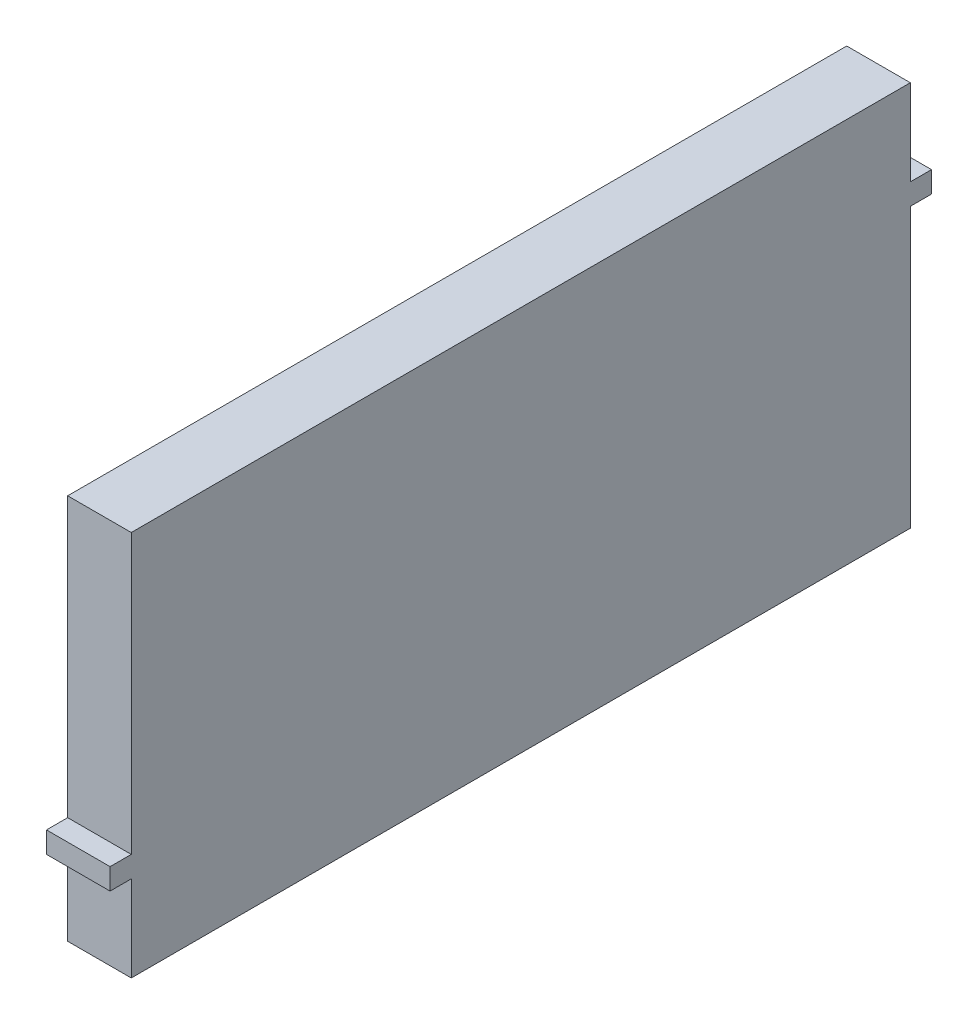
ISO-10303-21;
HEADER;
FILE_DESCRIPTION(('STEP AP214'),'2;1');
FILE_NAME('part.step','',(''),(''),'','','');
FILE_SCHEMA(('AUTOMOTIVE_DESIGN { 1 0 10303 214 1 1 1 1 }'));
ENDSEC;
DATA;
#1=APPLICATION_CONTEXT('core data for automotive mechanical design processes');
#2=APPLICATION_PROTOCOL_DEFINITION('international standard','automotive_design',2000,#1);
#3=PRODUCT_CONTEXT('',#1,'mechanical');
#4=PRODUCT('Part','Part','',(#3));
#5=PRODUCT_RELATED_PRODUCT_CATEGORY('part','',(#4));
#6=PRODUCT_DEFINITION_FORMATION('','',#4);
#7=PRODUCT_DEFINITION_CONTEXT('part definition',#1,'design');
#8=PRODUCT_DEFINITION('design','',#6,#7);
#9=PRODUCT_DEFINITION_SHAPE('','',#8);
#10=(LENGTH_UNIT() NAMED_UNIT(*) SI_UNIT(.MILLI.,.METRE.));
#11=(NAMED_UNIT(*) PLANE_ANGLE_UNIT() SI_UNIT($,.RADIAN.));
#12=(NAMED_UNIT(*) SI_UNIT($,.STERADIAN.) SOLID_ANGLE_UNIT());
#13=UNCERTAINTY_MEASURE_WITH_UNIT(LENGTH_MEASURE(1.E-05),#10,'distance_accuracy_value','');
#14=(GEOMETRIC_REPRESENTATION_CONTEXT(3) GLOBAL_UNCERTAINTY_ASSIGNED_CONTEXT((#13)) GLOBAL_UNIT_ASSIGNED_CONTEXT((#10,
#11,#12)) REPRESENTATION_CONTEXT('',''));
#15=CARTESIAN_POINT('',(0.,0.,0.));
#16=DIRECTION('',(0.,0.,1.));
#17=DIRECTION('',(1.,0.,0.));
#18=AXIS2_PLACEMENT_3D('',#15,#16,#17);
#19=CARTESIAN_POINT('',(388.468402146903,403.484208454733,439.53744407791));
#20=DIRECTION('',(0.,0.,1.));
#21=DIRECTION('',(0.,-1.,0.));
#22=AXIS2_PLACEMENT_3D('',#19,#20,#21);
#23=PLANE('',#22);
#24=DIRECTION('',(0.,1.,0.));
#25=VECTOR('',#24,1.);
#26=CARTESIAN_POINT('',(252.542706630704,403.484208454733,439.53744407791));
#27=LINE('',#26,#25);
#28=CARTESIAN_POINT('',(252.542706630704,403.484208454733,439.53744407791));
#29=VERTEX_POINT('',#28);
#30=CARTESIAN_POINT('',(252.542706630704,406.659208454733,439.53744407791));
#31=VERTEX_POINT('',#30);
#32=EDGE_CURVE('E168',#29,#31,#27,.T.);
#33=ORIENTED_EDGE('',*,*,#32,.F.);
#34=DIRECTION('',(-1.,0.,0.));
#35=VECTOR('',#34,1.);
#36=CARTESIAN_POINT('',(388.468402146903,403.484208454733,439.53744407791));
#37=LINE('',#36,#35);
#38=CARTESIAN_POINT('',(243.017706630704,403.484208454733,439.53744407791));
#39=VERTEX_POINT('',#38);
#40=EDGE_CURVE('E37',#29,#39,#37,.T.);
#41=ORIENTED_EDGE('',*,*,#40,.T.);
#42=DIRECTION('',(0.,1.,0.));
#43=VECTOR('',#42,1.);
#44=CARTESIAN_POINT('',(243.017706630704,403.484208454733,439.53744407791));
#45=LINE('',#44,#43);
#46=CARTESIAN_POINT('',(243.017706630704,406.659208454733,439.53744407791));
#47=VERTEX_POINT('',#46);
#48=EDGE_CURVE('E176',#39,#47,#45,.T.);
#49=ORIENTED_EDGE('',*,*,#48,.T.);
#50=DIRECTION('',(-1.,0.,0.));
#51=VECTOR('',#50,1.);
#52=CARTESIAN_POINT('',(388.468402146903,406.659208454733,439.53744407791));
#53=LINE('',#52,#51);
#54=EDGE_CURVE('E104',#31,#47,#53,.T.);
#55=ORIENTED_EDGE('',*,*,#54,.F.);
#56=EDGE_LOOP('',(#33,#41,#49,#55));
#57=FACE_BOUND('',#56,.T.);
#58=ADVANCED_FACE('F33',(#57),#23,.F.);
#59=CARTESIAN_POINT('',(388.468402146903,406.659208454733,439.53744407791));
#60=DIRECTION('',(0.,-1.,0.));
#61=DIRECTION('',(0.,0.,-1.));
#62=AXIS2_PLACEMENT_3D('',#59,#60,#61);
#63=PLANE('',#62);
#64=DIRECTION('',(0.,0.,1.));
#65=VECTOR('',#64,1.);
#66=CARTESIAN_POINT('',(252.542706630704,406.659208454733,439.53744407791));
#67=LINE('',#66,#65);
#68=CARTESIAN_POINT('',(252.542706630704,406.659208454733,442.71244407791));
#69=VERTEX_POINT('',#68);
#70=EDGE_CURVE('E111',#31,#69,#67,.T.);
#71=ORIENTED_EDGE('',*,*,#70,.F.);
#72=ORIENTED_EDGE('',*,*,#54,.T.);
#73=DIRECTION('',(0.,0.,1.));
#74=VECTOR('',#73,1.);
#75=CARTESIAN_POINT('',(243.017706630704,406.659208454733,439.53744407791));
#76=LINE('',#75,#74);
#77=CARTESIAN_POINT('',(243.017706630704,406.659208454733,442.71244407791));
#78=VERTEX_POINT('',#77);
#79=EDGE_CURVE('E175',#47,#78,#76,.T.);
#80=ORIENTED_EDGE('',*,*,#79,.T.);
#81=DIRECTION('',(-1.,0.,0.));
#82=VECTOR('',#81,1.);
#83=CARTESIAN_POINT('',(388.468402146903,406.659208454733,442.71244407791));
#84=LINE('',#83,#82);
#85=EDGE_CURVE('E177',#69,#78,#84,.T.);
#86=ORIENTED_EDGE('',*,*,#85,.F.);
#87=EDGE_LOOP('',(#71,#72,#80,#86));
#88=FACE_BOUND('',#87,.T.);
#89=ADVANCED_FACE('F226',(#88),#63,.F.);
#90=CARTESIAN_POINT('',(388.468402146903,406.659208454733,442.71244407791));
#91=DIRECTION('',(0.,0.,1.));
#92=DIRECTION('',(0.,-1.,0.));
#93=AXIS2_PLACEMENT_3D('',#90,#91,#92);
#94=PLANE('',#93);
#95=DIRECTION('',(0.,1.,0.));
#96=VECTOR('',#95,1.);
#97=CARTESIAN_POINT('',(252.542706630704,406.659208454733,442.71244407791));
#98=LINE('',#97,#96);
#99=CARTESIAN_POINT('',(252.542706630704,419.517958454733,442.71244407791));
#100=VERTEX_POINT('',#99);
#101=EDGE_CURVE('E164',#69,#100,#98,.T.);
#102=ORIENTED_EDGE('',*,*,#101,.F.);
#103=ORIENTED_EDGE('',*,*,#85,.T.);
#104=DIRECTION('',(0.,1.,0.));
#105=VECTOR('',#104,1.);
#106=CARTESIAN_POINT('',(243.017706630704,406.659208454733,442.71244407791));
#107=LINE('',#106,#105);
#108=CARTESIAN_POINT('',(243.017706630704,419.517958454733,442.71244407791));
#109=VERTEX_POINT('',#108);
#110=EDGE_CURVE('E179',#78,#109,#107,.T.);
#111=ORIENTED_EDGE('',*,*,#110,.T.);
#112=DIRECTION('',(-1.,0.,0.));
#113=VECTOR('',#112,1.);
#114=CARTESIAN_POINT('',(388.468402146903,419.517958454733,442.71244407791));
#115=LINE('',#114,#113);
#116=EDGE_CURVE('E180',#100,#109,#115,.T.);
#117=ORIENTED_EDGE('',*,*,#116,.F.);
#118=EDGE_LOOP('',(#102,#103,#111,#117));
#119=FACE_BOUND('',#118,.T.);
#120=ADVANCED_FACE('F229',(#119),#94,.F.);
#121=CARTESIAN_POINT('',(388.468402146903,419.517958454733,559.39369407791));
#122=DIRECTION('',(0.,-1.,0.));
#123=DIRECTION('',(0.,0.,-1.));
#124=AXIS2_PLACEMENT_3D('',#121,#122,#123);
#125=PLANE('',#124);
#126=DIRECTION('',(0.,0.,1.));
#127=VECTOR('',#126,1.);
#128=CARTESIAN_POINT('',(252.542706630704,419.517958454733,559.39369407791));
#129=LINE('',#128,#127);
#130=CARTESIAN_POINT('',(252.542706630704,419.517958454733,559.39369407791));
#131=VERTEX_POINT('',#130);
#132=EDGE_CURVE('E161',#100,#131,#129,.T.);
#133=ORIENTED_EDGE('',*,*,#132,.F.);
#134=ORIENTED_EDGE('',*,*,#116,.T.);
#135=DIRECTION('',(0.,0.,1.));
#136=VECTOR('',#135,1.);
#137=CARTESIAN_POINT('',(243.017706630704,419.517958454733,559.39369407791));
#138=LINE('',#137,#136);
#139=CARTESIAN_POINT('',(243.017706630704,419.517958454733,559.39369407791));
#140=VERTEX_POINT('',#139);
#141=EDGE_CURVE('E182',#109,#140,#138,.T.);
#142=ORIENTED_EDGE('',*,*,#141,.T.);
#143=DIRECTION('',(-1.,0.,0.));
#144=VECTOR('',#143,1.);
#145=CARTESIAN_POINT('',(388.468402146903,419.517958454733,559.39369407791));
#146=LINE('',#145,#144);
#147=EDGE_CURVE('E183',#131,#140,#146,.T.);
#148=ORIENTED_EDGE('',*,*,#147,.F.);
#149=EDGE_LOOP('',(#133,#134,#142,#148));
#150=FACE_BOUND('',#149,.T.);
#151=ADVANCED_FACE('F231',(#150),#125,.F.);
#152=CARTESIAN_POINT('',(388.468402146903,377.766708454733,559.39369407791));
#153=DIRECTION('',(0.,0.,-1.));
#154=DIRECTION('',(-1.,0.,0.));
#155=AXIS2_PLACEMENT_3D('',#152,#153,#154);
#156=PLANE('',#155);
#157=DIRECTION('',(0.,-1.,0.));
#158=VECTOR('',#157,1.);
#159=CARTESIAN_POINT('',(252.542706630704,377.766708454733,559.39369407791));
#160=LINE('',#159,#158);
#161=CARTESIAN_POINT('',(252.542706630704,377.766708454733,559.39369407791));
#162=VERTEX_POINT('',#161);
#163=EDGE_CURVE('E158',#131,#162,#160,.T.);
#164=ORIENTED_EDGE('',*,*,#163,.F.);
#165=ORIENTED_EDGE('',*,*,#147,.T.);
#166=DIRECTION('',(0.,-1.,0.));
#167=VECTOR('',#166,1.);
#168=CARTESIAN_POINT('',(243.017706630704,377.766708454733,559.39369407791));
#169=LINE('',#168,#167);
#170=CARTESIAN_POINT('',(243.017706630704,377.766708454733,559.39369407791));
#171=VERTEX_POINT('',#170);
#172=EDGE_CURVE('E185',#140,#171,#169,.T.);
#173=ORIENTED_EDGE('',*,*,#172,.T.);
#174=DIRECTION('',(-1.,0.,0.));
#175=VECTOR('',#174,1.);
#176=CARTESIAN_POINT('',(388.468402146903,377.766708454733,559.39369407791));
#177=LINE('',#176,#175);
#178=EDGE_CURVE('E186',#162,#171,#177,.T.);
#179=ORIENTED_EDGE('',*,*,#178,.F.);
#180=EDGE_LOOP('',(#164,#165,#173,#179));
#181=FACE_BOUND('',#180,.T.);
#182=ADVANCED_FACE('F235',(#181),#156,.F.);
#183=CARTESIAN_POINT('',(388.468402146903,377.766708454733,559.39369407791));
#184=DIRECTION('',(0.,-1.,0.));
#185=DIRECTION('',(0.,0.,-1.));
#186=AXIS2_PLACEMENT_3D('',#183,#184,#185);
#187=PLANE('',#186);
#188=DIRECTION('',(0.,0.,1.));
#189=VECTOR('',#188,1.);
#190=CARTESIAN_POINT('',(252.542706630704,377.766708454733,559.39369407791));
#191=LINE('',#190,#189);
#192=CARTESIAN_POINT('',(252.542706630704,377.766708454733,562.56869407791));
#193=VERTEX_POINT('',#192);
#194=EDGE_CURVE('E155',#162,#193,#191,.T.);
#195=ORIENTED_EDGE('',*,*,#194,.F.);
#196=ORIENTED_EDGE('',*,*,#178,.T.);
#197=DIRECTION('',(0.,0.,1.));
#198=VECTOR('',#197,1.);
#199=CARTESIAN_POINT('',(243.017706630704,377.766708454733,559.39369407791));
#200=LINE('',#199,#198);
#201=CARTESIAN_POINT('',(243.017706630704,377.766708454733,562.56869407791));
#202=VERTEX_POINT('',#201);
#203=EDGE_CURVE('E188',#171,#202,#200,.T.);
#204=ORIENTED_EDGE('',*,*,#203,.T.);
#205=DIRECTION('',(-1.,0.,0.));
#206=VECTOR('',#205,1.);
#207=CARTESIAN_POINT('',(388.468402146903,377.766708454733,562.56869407791));
#208=LINE('',#207,#206);
#209=EDGE_CURVE('E189',#193,#202,#208,.T.);
#210=ORIENTED_EDGE('',*,*,#209,.F.);
#211=EDGE_LOOP('',(#195,#196,#204,#210));
#212=FACE_BOUND('',#211,.T.);
#213=ADVANCED_FACE('F240',(#212),#187,.F.);
#214=CARTESIAN_POINT('',(388.468402146903,377.766708454733,562.56869407791));
#215=DIRECTION('',(0.,0.,-1.));
#216=DIRECTION('',(-1.,0.,0.));
#217=AXIS2_PLACEMENT_3D('',#214,#215,#216);
#218=PLANE('',#217);
#219=DIRECTION('',(0.,-1.,0.));
#220=VECTOR('',#219,1.);
#221=CARTESIAN_POINT('',(252.542706630704,377.766708454733,562.56869407791));
#222=LINE('',#221,#220);
#223=CARTESIAN_POINT('',(252.542706630704,374.591708454733,562.56869407791));
#224=VERTEX_POINT('',#223);
#225=EDGE_CURVE('E152',#193,#224,#222,.T.);
#226=ORIENTED_EDGE('',*,*,#225,.F.);
#227=ORIENTED_EDGE('',*,*,#209,.T.);
#228=DIRECTION('',(0.,-1.,0.));
#229=VECTOR('',#228,1.);
#230=CARTESIAN_POINT('',(243.017706630704,377.766708454733,562.56869407791));
#231=LINE('',#230,#229);
#232=CARTESIAN_POINT('',(243.017706630704,374.591708454733,562.56869407791));
#233=VERTEX_POINT('',#232);
#234=EDGE_CURVE('E191',#202,#233,#231,.T.);
#235=ORIENTED_EDGE('',*,*,#234,.T.);
#236=DIRECTION('',(-1.,0.,0.));
#237=VECTOR('',#236,1.);
#238=CARTESIAN_POINT('',(388.468402146903,374.591708454733,562.56869407791));
#239=LINE('',#238,#237);
#240=EDGE_CURVE('E192',#224,#233,#239,.T.);
#241=ORIENTED_EDGE('',*,*,#240,.F.);
#242=EDGE_LOOP('',(#226,#227,#235,#241));
#243=FACE_BOUND('',#242,.T.);
#244=ADVANCED_FACE('F243',(#243),#218,.F.);
#245=CARTESIAN_POINT('',(388.468402146903,374.591708454733,562.56869407791));
#246=DIRECTION('',(0.,1.,0.));
#247=DIRECTION('',(0.,0.,1.));
#248=AXIS2_PLACEMENT_3D('',#245,#246,#247);
#249=PLANE('',#248);
#250=DIRECTION('',(0.,0.,-1.));
#251=VECTOR('',#250,1.);
#252=CARTESIAN_POINT('',(252.542706630704,374.591708454733,562.56869407791));
#253=LINE('',#252,#251);
#254=CARTESIAN_POINT('',(252.542706630704,374.591708454733,559.39369407791));
#255=VERTEX_POINT('',#254);
#256=EDGE_CURVE('E147',#224,#255,#253,.T.);
#257=ORIENTED_EDGE('',*,*,#256,.F.);
#258=ORIENTED_EDGE('',*,*,#240,.T.);
#259=DIRECTION('',(0.,0.,-1.));
#260=VECTOR('',#259,1.);
#261=CARTESIAN_POINT('',(243.017706630704,374.591708454733,562.56869407791));
#262=LINE('',#261,#260);
#263=CARTESIAN_POINT('',(243.017706630704,374.591708454733,559.39369407791));
#264=VERTEX_POINT('',#263);
#265=EDGE_CURVE('E194',#233,#264,#262,.T.);
#266=ORIENTED_EDGE('',*,*,#265,.T.);
#267=DIRECTION('',(-1.,0.,0.));
#268=VECTOR('',#267,1.);
#269=CARTESIAN_POINT('',(388.468402146903,374.591708454733,559.39369407791));
#270=LINE('',#269,#268);
#271=EDGE_CURVE('E195',#255,#264,#270,.T.);
#272=ORIENTED_EDGE('',*,*,#271,.F.);
#273=EDGE_LOOP('',(#257,#258,#266,#272));
#274=FACE_BOUND('',#273,.T.);
#275=ADVANCED_FACE('F247',(#274),#249,.F.);
#276=CARTESIAN_POINT('',(388.468402146903,361.732958454733,559.39369407791));
#277=DIRECTION('',(0.,0.,-1.));
#278=DIRECTION('',(-1.,0.,0.));
#279=AXIS2_PLACEMENT_3D('',#276,#277,#278);
#280=PLANE('',#279);
#281=DIRECTION('',(0.,-1.,0.));
#282=VECTOR('',#281,1.);
#283=CARTESIAN_POINT('',(252.542706630704,361.732958454733,559.39369407791));
#284=LINE('',#283,#282);
#285=CARTESIAN_POINT('',(252.542706630704,361.732958454733,559.39369407791));
#286=VERTEX_POINT('',#285);
#287=EDGE_CURVE('E145',#255,#286,#284,.T.);
#288=ORIENTED_EDGE('',*,*,#287,.F.);
#289=ORIENTED_EDGE('',*,*,#271,.T.);
#290=DIRECTION('',(0.,-1.,0.));
#291=VECTOR('',#290,1.);
#292=CARTESIAN_POINT('',(243.017706630704,361.732958454733,559.39369407791));
#293=LINE('',#292,#291);
#294=CARTESIAN_POINT('',(243.017706630704,361.732958454733,559.39369407791));
#295=VERTEX_POINT('',#294);
#296=EDGE_CURVE('E197',#264,#295,#293,.T.);
#297=ORIENTED_EDGE('',*,*,#296,.T.);
#298=DIRECTION('',(-1.,0.,0.));
#299=VECTOR('',#298,1.);
#300=CARTESIAN_POINT('',(388.468402146903,361.732958454733,559.39369407791));
#301=LINE('',#300,#299);
#302=EDGE_CURVE('E198',#286,#295,#301,.T.);
#303=ORIENTED_EDGE('',*,*,#302,.F.);
#304=EDGE_LOOP('',(#288,#289,#297,#303));
#305=FACE_BOUND('',#304,.T.);
#306=ADVANCED_FACE('F251',(#305),#280,.F.);
#307=CARTESIAN_POINT('',(388.468402146903,361.732958454733,442.71244407791));
#308=DIRECTION('',(0.,1.,0.));
#309=DIRECTION('',(0.,0.,1.));
#310=AXIS2_PLACEMENT_3D('',#307,#308,#309);
#311=PLANE('',#310);
#312=DIRECTION('',(0.,0.,-1.));
#313=VECTOR('',#312,1.);
#314=CARTESIAN_POINT('',(252.542706630704,361.732958454733,442.71244407791));
#315=LINE('',#314,#313);
#316=CARTESIAN_POINT('',(252.542706630704,361.732958454733,442.71244407791));
#317=VERTEX_POINT('',#316);
#318=EDGE_CURVE('E42',#286,#317,#315,.T.);
#319=ORIENTED_EDGE('',*,*,#318,.F.);
#320=ORIENTED_EDGE('',*,*,#302,.T.);
#321=DIRECTION('',(0.,0.,-1.));
#322=VECTOR('',#321,1.);
#323=CARTESIAN_POINT('',(243.017706630704,361.732958454733,442.71244407791));
#324=LINE('',#323,#322);
#325=CARTESIAN_POINT('',(243.017706630704,361.732958454733,442.71244407791));
#326=VERTEX_POINT('',#325);
#327=EDGE_CURVE('E139',#295,#326,#324,.T.);
#328=ORIENTED_EDGE('',*,*,#327,.T.);
#329=DIRECTION('',(-1.,0.,0.));
#330=VECTOR('',#329,1.);
#331=CARTESIAN_POINT('',(388.468402146903,361.732958454733,442.71244407791));
#332=LINE('',#331,#330);
#333=EDGE_CURVE('E130',#317,#326,#332,.T.);
#334=ORIENTED_EDGE('',*,*,#333,.F.);
#335=EDGE_LOOP('',(#319,#320,#328,#334));
#336=FACE_BOUND('',#335,.T.);
#337=ADVANCED_FACE('F136',(#336),#311,.F.);
#338=CARTESIAN_POINT('',(388.468402146903,403.484208454733,442.71244407791));
#339=DIRECTION('',(0.,0.,1.));
#340=DIRECTION('',(1.,0.,0.));
#341=AXIS2_PLACEMENT_3D('',#338,#339,#340);
#342=PLANE('',#341);
#343=DIRECTION('',(0.,1.,0.));
#344=VECTOR('',#343,1.);
#345=CARTESIAN_POINT('',(252.542706630704,403.484208454733,442.71244407791));
#346=LINE('',#345,#344);
#347=CARTESIAN_POINT('',(252.542706630704,403.484208454733,442.71244407791));
#348=VERTEX_POINT('',#347);
#349=EDGE_CURVE('E11',#317,#348,#346,.T.);
#350=ORIENTED_EDGE('',*,*,#349,.F.);
#351=ORIENTED_EDGE('',*,*,#333,.T.);
#352=DIRECTION('',(0.,1.,0.));
#353=VECTOR('',#352,1.);
#354=CARTESIAN_POINT('',(243.017706630704,403.484208454733,442.71244407791));
#355=LINE('',#354,#353);
#356=CARTESIAN_POINT('',(243.017706630704,403.484208454733,442.71244407791));
#357=VERTEX_POINT('',#356);
#358=EDGE_CURVE('E141',#326,#357,#355,.T.);
#359=ORIENTED_EDGE('',*,*,#358,.T.);
#360=DIRECTION('',(-1.,0.,0.));
#361=VECTOR('',#360,1.);
#362=CARTESIAN_POINT('',(388.468402146903,403.484208454733,442.71244407791));
#363=LINE('',#362,#361);
#364=EDGE_CURVE('E55',#348,#357,#363,.T.);
#365=ORIENTED_EDGE('',*,*,#364,.F.);
#366=EDGE_LOOP('',(#350,#351,#359,#365));
#367=FACE_BOUND('',#366,.T.);
#368=ADVANCED_FACE('F129',(#367),#342,.F.);
#369=CARTESIAN_POINT('',(388.468402146903,403.484208454733,442.71244407791));
#370=DIRECTION('',(0.,1.,0.));
#371=DIRECTION('',(0.,0.,1.));
#372=AXIS2_PLACEMENT_3D('',#369,#370,#371);
#373=PLANE('',#372);
#374=DIRECTION('',(0.,0.,-1.));
#375=VECTOR('',#374,1.);
#376=CARTESIAN_POINT('',(252.542706630704,403.484208454733,442.71244407791));
#377=LINE('',#376,#375);
#378=EDGE_CURVE('E171',#348,#29,#377,.T.);
#379=ORIENTED_EDGE('',*,*,#378,.F.);
#380=ORIENTED_EDGE('',*,*,#364,.T.);
#381=DIRECTION('',(0.,0.,-1.));
#382=VECTOR('',#381,1.);
#383=CARTESIAN_POINT('',(243.017706630704,403.484208454733,442.71244407791));
#384=LINE('',#383,#382);
#385=EDGE_CURVE('E173',#357,#39,#384,.T.);
#386=ORIENTED_EDGE('',*,*,#385,.T.);
#387=ORIENTED_EDGE('',*,*,#40,.F.);
#388=EDGE_LOOP('',(#379,#380,#386,#387));
#389=FACE_BOUND('',#388,.T.);
#390=ADVANCED_FACE('F221',(#389),#373,.F.);
#391=CARTESIAN_POINT('',(243.017706630704,0.,0.));
#392=DIRECTION('',(1.,0.,0.));
#393=DIRECTION('',(0.,0.,-1.));
#394=AXIS2_PLACEMENT_3D('',#391,#392,#393);
#395=PLANE('',#394);
#396=ORIENTED_EDGE('',*,*,#48,.F.);
#397=ORIENTED_EDGE('',*,*,#385,.F.);
#398=ORIENTED_EDGE('',*,*,#358,.F.);
#399=ORIENTED_EDGE('',*,*,#327,.F.);
#400=ORIENTED_EDGE('',*,*,#296,.F.);
#401=ORIENTED_EDGE('',*,*,#265,.F.);
#402=ORIENTED_EDGE('',*,*,#234,.F.);
#403=ORIENTED_EDGE('',*,*,#203,.F.);
#404=ORIENTED_EDGE('',*,*,#172,.F.);
#405=ORIENTED_EDGE('',*,*,#141,.F.);
#406=ORIENTED_EDGE('',*,*,#110,.F.);
#407=ORIENTED_EDGE('',*,*,#79,.F.);
#408=EDGE_LOOP('',(#396,#397,#398,#399,#400,#401,#402,#403,#404,#405,#406,#407));
#409=FACE_BOUND('',#408,.T.);
#410=ADVANCED_FACE('F223',(#409),#395,.F.);
#411=CARTESIAN_POINT('',(252.542706630704,403.484208454733,802.28119407791));
#412=DIRECTION('',(1.,0.,0.));
#413=DIRECTION('',(0.,0.,-1.));
#414=AXIS2_PLACEMENT_3D('',#411,#412,#413);
#415=PLANE('',#414);
#416=ORIENTED_EDGE('',*,*,#378,.T.);
#417=ORIENTED_EDGE('',*,*,#32,.T.);
#418=ORIENTED_EDGE('',*,*,#70,.T.);
#419=ORIENTED_EDGE('',*,*,#101,.T.);
#420=ORIENTED_EDGE('',*,*,#132,.T.);
#421=ORIENTED_EDGE('',*,*,#163,.T.);
#422=ORIENTED_EDGE('',*,*,#194,.T.);
#423=ORIENTED_EDGE('',*,*,#225,.T.);
#424=ORIENTED_EDGE('',*,*,#256,.T.);
#425=ORIENTED_EDGE('',*,*,#287,.T.);
#426=ORIENTED_EDGE('',*,*,#318,.T.);
#427=ORIENTED_EDGE('',*,*,#349,.T.);
#428=EDGE_LOOP('',(#416,#417,#418,#419,#420,#421,#422,#423,#424,#425,#426,#427));
#429=FACE_BOUND('',#428,.T.);
#430=ADVANCED_FACE('F35',(#429),#415,.T.);
#431=CLOSED_SHELL('',(#58,#89,#120,#151,#182,#213,#244,#275,#306,#337,#368,#390,#410,#430));
#432=MANIFOLD_SOLID_BREP('B2',#431);
#433=ADVANCED_BREP_SHAPE_REPRESENTATION('',(#18,#432),#14);
#434=SHAPE_DEFINITION_REPRESENTATION(#9,#433);
ENDSEC;
END-ISO-10303-21;
